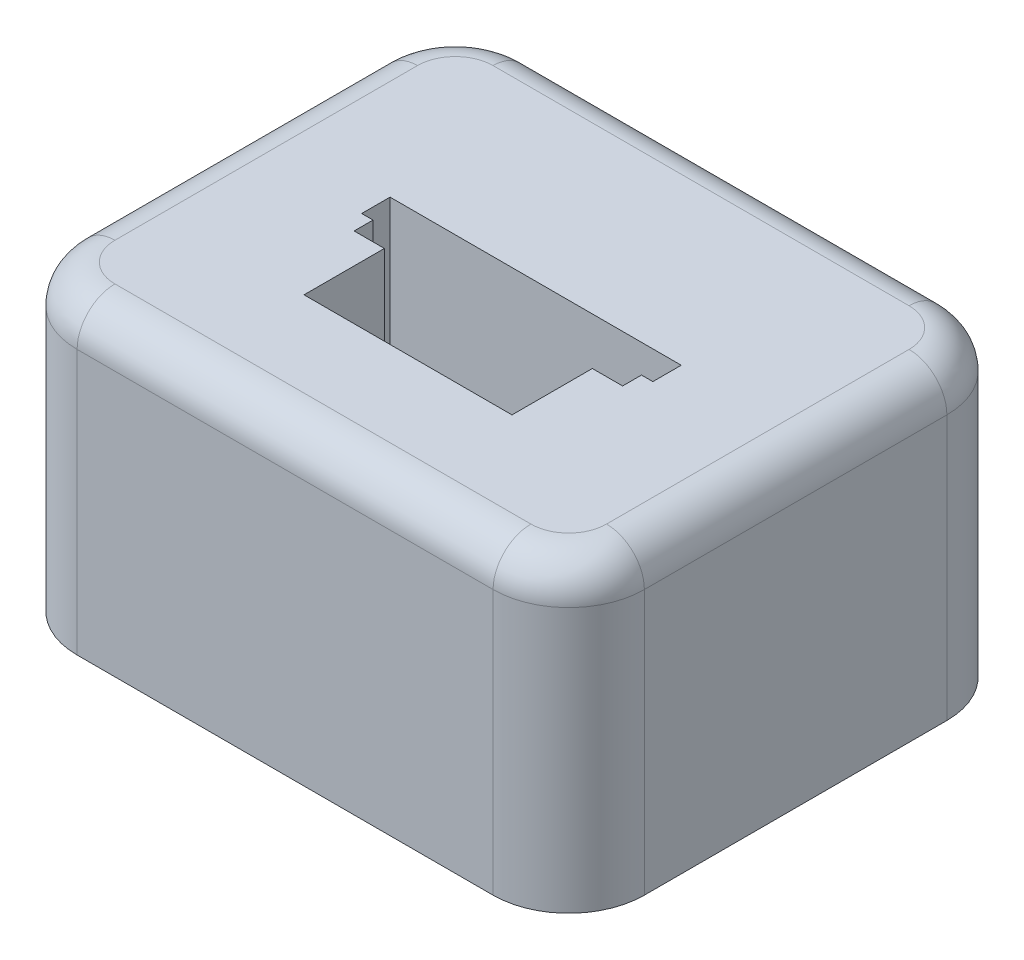
ISO-10303-21;
HEADER;
FILE_DESCRIPTION(('STEP AP214'),'2;1');
FILE_NAME('part.step','',(''),(''),'','','');
FILE_SCHEMA(('AUTOMOTIVE_DESIGN { 1 0 10303 214 1 1 1 1 }'));
ENDSEC;
DATA;
#1=APPLICATION_CONTEXT('core data for automotive mechanical design processes');
#2=APPLICATION_PROTOCOL_DEFINITION('international standard','automotive_design',2000,#1);
#3=PRODUCT_CONTEXT('',#1,'mechanical');
#4=PRODUCT('Part','Part','',(#3));
#5=PRODUCT_RELATED_PRODUCT_CATEGORY('part','',(#4));
#6=PRODUCT_DEFINITION_FORMATION('','',#4);
#7=PRODUCT_DEFINITION_CONTEXT('part definition',#1,'design');
#8=PRODUCT_DEFINITION('design','',#6,#7);
#9=PRODUCT_DEFINITION_SHAPE('','',#8);
#10=(LENGTH_UNIT() NAMED_UNIT(*) SI_UNIT(.MILLI.,.METRE.));
#11=(NAMED_UNIT(*) PLANE_ANGLE_UNIT() SI_UNIT($,.RADIAN.));
#12=(NAMED_UNIT(*) SI_UNIT($,.STERADIAN.) SOLID_ANGLE_UNIT());
#13=UNCERTAINTY_MEASURE_WITH_UNIT(LENGTH_MEASURE(1.E-05),#10,'distance_accuracy_value','');
#14=(GEOMETRIC_REPRESENTATION_CONTEXT(3) GLOBAL_UNCERTAINTY_ASSIGNED_CONTEXT((#13)) GLOBAL_UNIT_ASSIGNED_CONTEXT((#10,
#11,#12)) REPRESENTATION_CONTEXT('',''));
#15=CARTESIAN_POINT('',(0.,0.,0.));
#16=DIRECTION('',(0.,0.,1.));
#17=DIRECTION('',(1.,0.,0.));
#18=AXIS2_PLACEMENT_3D('',#15,#16,#17);
#19=CARTESIAN_POINT('',(26.,16.,-20.));
#20=DIRECTION('',(0.,-1.,0.));
#21=DIRECTION('',(0.,0.,-1.));
#22=AXIS2_PLACEMENT_3D('',#19,#20,#21);
#23=CYLINDRICAL_SURFACE('',#22,4.);
#24=DIRECTION('',(0.,-1.,0.));
#25=VECTOR('',#24,1.);
#26=CARTESIAN_POINT('',(26.,16.,-24.));
#27=LINE('',#26,#25);
#28=CARTESIAN_POINT('',(26.,14.,-24.));
#29=VERTEX_POINT('',#28);
#30=CARTESIAN_POINT('',(26.,0.,-24.));
#31=VERTEX_POINT('',#30);
#32=EDGE_CURVE('E470',#29,#31,#27,.T.);
#33=ORIENTED_EDGE('',*,*,#32,.F.);
#34=CARTESIAN_POINT('',(26.,14.,-20.));
#35=DIRECTION('',(0.,-1.,0.));
#36=DIRECTION('',(0.,0.,-1.));
#37=AXIS2_PLACEMENT_3D('',#34,#35,#36);
#38=CIRCLE('',#37,4.);
#39=CARTESIAN_POINT('',(30.,14.,-20.));
#40=VERTEX_POINT('',#39);
#41=EDGE_CURVE('E517',#29,#40,#38,.T.);
#42=ORIENTED_EDGE('',*,*,#41,.T.);
#43=DIRECTION('',(0.,-1.,0.));
#44=VECTOR('',#43,1.);
#45=CARTESIAN_POINT('',(30.,16.,-20.));
#46=LINE('',#45,#44);
#47=CARTESIAN_POINT('',(30.,0.,-20.));
#48=VERTEX_POINT('',#47);
#49=EDGE_CURVE('E449',#40,#48,#46,.T.);
#50=ORIENTED_EDGE('',*,*,#49,.T.);
#51=CARTESIAN_POINT('',(26.,0.,-20.));
#52=DIRECTION('',(0.,1.,0.));
#53=DIRECTION('',(0.,0.,-1.));
#54=AXIS2_PLACEMENT_3D('',#51,#52,#53);
#55=CIRCLE('',#54,4.);
#56=EDGE_CURVE('E416',#48,#31,#55,.T.);
#57=ORIENTED_EDGE('',*,*,#56,.T.);
#58=EDGE_LOOP('',(#33,#42,#50,#57));
#59=FACE_BOUND('',#58,.T.);
#60=ADVANCED_FACE('F45',(#59),#23,.T.);
#61=CARTESIAN_POINT('',(4.00000000000003,16.,-24.));
#62=DIRECTION('',(0.,0.,1.));
#63=DIRECTION('',(1.,0.,0.));
#64=AXIS2_PLACEMENT_3D('',#61,#62,#63);
#65=PLANE('',#64);
#66=DIRECTION('',(0.,-1.,0.));
#67=VECTOR('',#66,1.);
#68=CARTESIAN_POINT('',(4.00000000000003,16.,-24.));
#69=LINE('',#68,#67);
#70=CARTESIAN_POINT('',(4.00000000000003,14.,-24.));
#71=VERTEX_POINT('',#70);
#72=CARTESIAN_POINT('',(4.00000000000003,0.,-24.));
#73=VERTEX_POINT('',#72);
#74=EDGE_CURVE('E467',#71,#73,#69,.T.);
#75=ORIENTED_EDGE('',*,*,#74,.F.);
#76=DIRECTION('',(-1.,0.,0.));
#77=VECTOR('',#76,1.);
#78=CARTESIAN_POINT('',(4.00000000000003,14.,-24.));
#79=LINE('',#78,#77);
#80=EDGE_CURVE('E514',#71,#29,#79,.F.);
#81=ORIENTED_EDGE('',*,*,#80,.T.);
#82=ORIENTED_EDGE('',*,*,#32,.T.);
#83=DIRECTION('',(-1.,0.,0.));
#84=VECTOR('',#83,1.);
#85=CARTESIAN_POINT('',(4.00000000000003,0.,-24.));
#86=LINE('',#85,#84);
#87=EDGE_CURVE('E420',#31,#73,#86,.T.);
#88=ORIENTED_EDGE('',*,*,#87,.T.);
#89=EDGE_LOOP('',(#75,#81,#82,#88));
#90=FACE_BOUND('',#89,.T.);
#91=ADVANCED_FACE('F633',(#90),#65,.F.);
#92=CARTESIAN_POINT('',(4.,16.,-20.));
#93=DIRECTION('',(0.,-1.,0.));
#94=DIRECTION('',(0.,0.,-1.));
#95=AXIS2_PLACEMENT_3D('',#92,#93,#94);
#96=CYLINDRICAL_SURFACE('',#95,4.);
#97=DIRECTION('',(0.,-1.,0.));
#98=VECTOR('',#97,1.);
#99=CARTESIAN_POINT('',(0.,16.,-20.));
#100=LINE('',#99,#98);
#101=CARTESIAN_POINT('',(0.,14.,-20.));
#102=VERTEX_POINT('',#101);
#103=CARTESIAN_POINT('',(0.,0.,-20.));
#104=VERTEX_POINT('',#103);
#105=EDGE_CURVE('E464',#102,#104,#100,.T.);
#106=ORIENTED_EDGE('',*,*,#105,.F.);
#107=CARTESIAN_POINT('',(4.,14.,-20.));
#108=DIRECTION('',(0.,-1.,0.));
#109=DIRECTION('',(0.,0.,-1.));
#110=AXIS2_PLACEMENT_3D('',#107,#108,#109);
#111=CIRCLE('',#110,4.);
#112=EDGE_CURVE('E511',#102,#71,#111,.T.);
#113=ORIENTED_EDGE('',*,*,#112,.T.);
#114=ORIENTED_EDGE('',*,*,#74,.T.);
#115=CARTESIAN_POINT('',(4.,0.,-20.));
#116=DIRECTION('',(0.,1.,0.));
#117=DIRECTION('',(0.,0.,-1.));
#118=AXIS2_PLACEMENT_3D('',#115,#116,#117);
#119=CIRCLE('',#118,4.);
#120=EDGE_CURVE('E425',#73,#104,#119,.T.);
#121=ORIENTED_EDGE('',*,*,#120,.T.);
#122=EDGE_LOOP('',(#106,#113,#114,#121));
#123=FACE_BOUND('',#122,.T.);
#124=ADVANCED_FACE('F639',(#123),#96,.T.);
#125=CARTESIAN_POINT('',(0.,16.,-4.00000000000003));
#126=DIRECTION('',(1.,0.,0.));
#127=DIRECTION('',(0.,0.,-1.));
#128=AXIS2_PLACEMENT_3D('',#125,#126,#127);
#129=PLANE('',#128);
#130=DIRECTION('',(0.,-1.,0.));
#131=VECTOR('',#130,1.);
#132=CARTESIAN_POINT('',(0.,16.,-4.00000000000003));
#133=LINE('',#132,#131);
#134=CARTESIAN_POINT('',(0.,14.,-4.00000000000003));
#135=VERTEX_POINT('',#134);
#136=CARTESIAN_POINT('',(0.,0.,-4.00000000000003));
#137=VERTEX_POINT('',#136);
#138=EDGE_CURVE('E461',#135,#137,#133,.T.);
#139=ORIENTED_EDGE('',*,*,#138,.F.);
#140=DIRECTION('',(0.,0.,1.));
#141=VECTOR('',#140,1.);
#142=CARTESIAN_POINT('',(0.,14.,-4.00000000000003));
#143=LINE('',#142,#141);
#144=EDGE_CURVE('E508',#135,#102,#143,.F.);
#145=ORIENTED_EDGE('',*,*,#144,.T.);
#146=ORIENTED_EDGE('',*,*,#105,.T.);
#147=DIRECTION('',(0.,0.,1.));
#148=VECTOR('',#147,1.);
#149=CARTESIAN_POINT('',(0.,0.,-4.00000000000003));
#150=LINE('',#149,#148);
#151=EDGE_CURVE('E429',#104,#137,#150,.T.);
#152=ORIENTED_EDGE('',*,*,#151,.T.);
#153=EDGE_LOOP('',(#139,#145,#146,#152));
#154=FACE_BOUND('',#153,.T.);
#155=ADVANCED_FACE('F696',(#154),#129,.F.);
#156=CARTESIAN_POINT('',(4.,16.,-4.));
#157=DIRECTION('',(0.,-1.,0.));
#158=DIRECTION('',(0.,0.,-1.));
#159=AXIS2_PLACEMENT_3D('',#156,#157,#158);
#160=CYLINDRICAL_SURFACE('',#159,4.);
#161=DIRECTION('',(0.,-1.,0.));
#162=VECTOR('',#161,1.);
#163=CARTESIAN_POINT('',(4.00000000000003,16.,0.));
#164=LINE('',#163,#162);
#165=CARTESIAN_POINT('',(4.00000000000003,14.,0.));
#166=VERTEX_POINT('',#165);
#167=CARTESIAN_POINT('',(4.00000000000003,0.,0.));
#168=VERTEX_POINT('',#167);
#169=EDGE_CURVE('E458',#166,#168,#164,.T.);
#170=ORIENTED_EDGE('',*,*,#169,.F.);
#171=CARTESIAN_POINT('',(4.,14.,-4.));
#172=DIRECTION('',(0.,-1.,0.));
#173=DIRECTION('',(0.,0.,-1.));
#174=AXIS2_PLACEMENT_3D('',#171,#172,#173);
#175=CIRCLE('',#174,4.);
#176=EDGE_CURVE('E505',#166,#135,#175,.T.);
#177=ORIENTED_EDGE('',*,*,#176,.T.);
#178=ORIENTED_EDGE('',*,*,#138,.T.);
#179=CARTESIAN_POINT('',(4.,0.,-4.));
#180=DIRECTION('',(0.,1.,0.));
#181=DIRECTION('',(0.,0.,-1.));
#182=AXIS2_PLACEMENT_3D('',#179,#180,#181);
#183=CIRCLE('',#182,4.);
#184=EDGE_CURVE('E433',#137,#168,#183,.T.);
#185=ORIENTED_EDGE('',*,*,#184,.T.);
#186=EDGE_LOOP('',(#170,#177,#178,#185));
#187=FACE_BOUND('',#186,.T.);
#188=ADVANCED_FACE('F699',(#187),#160,.T.);
#189=CARTESIAN_POINT('',(4.00000000000003,16.,0.));
#190=DIRECTION('',(0.,0.,-1.));
#191=DIRECTION('',(-1.,0.,0.));
#192=AXIS2_PLACEMENT_3D('',#189,#190,#191);
#193=PLANE('',#192);
#194=DIRECTION('',(0.,-1.,0.));
#195=VECTOR('',#194,1.);
#196=CARTESIAN_POINT('',(26.,16.,0.));
#197=LINE('',#196,#195);
#198=CARTESIAN_POINT('',(26.,14.,0.));
#199=VERTEX_POINT('',#198);
#200=CARTESIAN_POINT('',(26.,0.,0.));
#201=VERTEX_POINT('',#200);
#202=EDGE_CURVE('E455',#199,#201,#197,.T.);
#203=ORIENTED_EDGE('',*,*,#202,.F.);
#204=DIRECTION('',(1.,0.,0.));
#205=VECTOR('',#204,1.);
#206=CARTESIAN_POINT('',(4.00000000000003,14.,0.));
#207=LINE('',#206,#205);
#208=EDGE_CURVE('E502',#199,#166,#207,.F.);
#209=ORIENTED_EDGE('',*,*,#208,.T.);
#210=ORIENTED_EDGE('',*,*,#169,.T.);
#211=DIRECTION('',(1.,0.,0.));
#212=VECTOR('',#211,1.);
#213=CARTESIAN_POINT('',(4.00000000000003,0.,0.));
#214=LINE('',#213,#212);
#215=EDGE_CURVE('E437',#168,#201,#214,.T.);
#216=ORIENTED_EDGE('',*,*,#215,.T.);
#217=EDGE_LOOP('',(#203,#209,#210,#216));
#218=FACE_BOUND('',#217,.T.);
#219=ADVANCED_FACE('F724',(#218),#193,.F.);
#220=CARTESIAN_POINT('',(26.,16.,-4.));
#221=DIRECTION('',(0.,-1.,0.));
#222=DIRECTION('',(0.,0.,-1.));
#223=AXIS2_PLACEMENT_3D('',#220,#221,#222);
#224=CYLINDRICAL_SURFACE('',#223,4.);
#225=DIRECTION('',(0.,-1.,0.));
#226=VECTOR('',#225,1.);
#227=CARTESIAN_POINT('',(30.,16.,-4.00000000000003));
#228=LINE('',#227,#226);
#229=CARTESIAN_POINT('',(30.,14.,-4.00000000000003));
#230=VERTEX_POINT('',#229);
#231=CARTESIAN_POINT('',(30.,0.,-4.00000000000003));
#232=VERTEX_POINT('',#231);
#233=EDGE_CURVE('E452',#230,#232,#228,.T.);
#234=ORIENTED_EDGE('',*,*,#233,.F.);
#235=CARTESIAN_POINT('',(26.,14.,-4.));
#236=DIRECTION('',(0.,-1.,0.));
#237=DIRECTION('',(0.,0.,-1.));
#238=AXIS2_PLACEMENT_3D('',#235,#236,#237);
#239=CIRCLE('',#238,4.);
#240=EDGE_CURVE('E498',#230,#199,#239,.T.);
#241=ORIENTED_EDGE('',*,*,#240,.T.);
#242=ORIENTED_EDGE('',*,*,#202,.T.);
#243=CARTESIAN_POINT('',(26.,0.,-4.));
#244=DIRECTION('',(0.,1.,0.));
#245=DIRECTION('',(0.,0.,1.));
#246=AXIS2_PLACEMENT_3D('',#243,#244,#245);
#247=CIRCLE('',#246,4.);
#248=EDGE_CURVE('E441',#201,#232,#247,.T.);
#249=ORIENTED_EDGE('',*,*,#248,.T.);
#250=EDGE_LOOP('',(#234,#241,#242,#249));
#251=FACE_BOUND('',#250,.T.);
#252=ADVANCED_FACE('F720',(#251),#224,.T.);
#253=CARTESIAN_POINT('',(30.,16.,-4.00000000000003));
#254=DIRECTION('',(-1.,0.,0.));
#255=DIRECTION('',(0.,0.,1.));
#256=AXIS2_PLACEMENT_3D('',#253,#254,#255);
#257=PLANE('',#256);
#258=ORIENTED_EDGE('',*,*,#49,.F.);
#259=DIRECTION('',(0.,0.,-1.));
#260=VECTOR('',#259,1.);
#261=CARTESIAN_POINT('',(30.,14.,-4.00000000000003));
#262=LINE('',#261,#260);
#263=EDGE_CURVE('E520',#40,#230,#262,.F.);
#264=ORIENTED_EDGE('',*,*,#263,.T.);
#265=ORIENTED_EDGE('',*,*,#233,.T.);
#266=DIRECTION('',(0.,0.,-1.));
#267=VECTOR('',#266,1.);
#268=CARTESIAN_POINT('',(30.,0.,-4.00000000000003));
#269=LINE('',#268,#267);
#270=EDGE_CURVE('E445',#232,#48,#269,.T.);
#271=ORIENTED_EDGE('',*,*,#270,.T.);
#272=EDGE_LOOP('',(#258,#264,#265,#271));
#273=FACE_BOUND('',#272,.T.);
#274=ADVANCED_FACE('F715',(#273),#257,.F.);
#275=CARTESIAN_POINT('',(26.,16.,-20.));
#276=DIRECTION('',(0.,-1.,0.));
#277=DIRECTION('',(0.,0.,-1.));
#278=AXIS2_PLACEMENT_3D('',#275,#276,#277);
#279=PLANE('',#278);
#280=DIRECTION('',(0.,0.,-1.));
#281=VECTOR('',#280,1.);
#282=CARTESIAN_POINT('',(22.1,16.,-11.75));
#283=LINE('',#282,#281);
#284=CARTESIAN_POINT('',(22.1,16.,-10.75));
#285=VERTEX_POINT('',#284);
#286=CARTESIAN_POINT('',(22.1,16.,-11.75));
#287=VERTEX_POINT('',#286);
#288=EDGE_CURVE('E69',#285,#287,#283,.T.);
#289=ORIENTED_EDGE('',*,*,#288,.F.);
#290=DIRECTION('',(1.,0.,0.));
#291=VECTOR('',#290,1.);
#292=CARTESIAN_POINT('',(7.9,16.,-10.75));
#293=LINE('',#292,#291);
#294=CARTESIAN_POINT('',(20.5,16.,-10.75));
#295=VERTEX_POINT('',#294);
#296=EDGE_CURVE('E252',#295,#285,#293,.T.);
#297=ORIENTED_EDGE('',*,*,#296,.F.);
#298=DIRECTION('',(0.,0.,-1.));
#299=VECTOR('',#298,1.);
#300=CARTESIAN_POINT('',(20.5,16.,-9.5));
#301=LINE('',#300,#299);
#302=CARTESIAN_POINT('',(20.5,16.,-6.5));
#303=VERTEX_POINT('',#302);
#304=EDGE_CURVE('E360',#303,#295,#301,.T.);
#305=ORIENTED_EDGE('',*,*,#304,.F.);
#306=DIRECTION('',(1.,0.,0.));
#307=VECTOR('',#306,1.);
#308=CARTESIAN_POINT('',(9.5,16.,-6.5));
#309=LINE('',#308,#307);
#310=CARTESIAN_POINT('',(9.5,16.,-6.5));
#311=VERTEX_POINT('',#310);
#312=EDGE_CURVE('E356',#311,#303,#309,.T.);
#313=ORIENTED_EDGE('',*,*,#312,.F.);
#314=DIRECTION('',(0.,0.,1.));
#315=VECTOR('',#314,1.);
#316=CARTESIAN_POINT('',(9.5,16.,-9.5));
#317=LINE('',#316,#315);
#318=CARTESIAN_POINT('',(9.5,16.,-10.75));
#319=VERTEX_POINT('',#318);
#320=EDGE_CURVE('E353',#319,#311,#317,.T.);
#321=ORIENTED_EDGE('',*,*,#320,.F.);
#322=CARTESIAN_POINT('',(7.9,16.,-10.75));
#323=VERTEX_POINT('',#322);
#324=EDGE_CURVE('E585',#323,#319,#293,.T.);
#325=ORIENTED_EDGE('',*,*,#324,.F.);
#326=DIRECTION('',(0.,0.,1.));
#327=VECTOR('',#326,1.);
#328=CARTESIAN_POINT('',(7.9,16.,-11.75));
#329=LINE('',#328,#327);
#330=CARTESIAN_POINT('',(7.9,16.,-11.75));
#331=VERTEX_POINT('',#330);
#332=EDGE_CURVE('E596',#331,#323,#329,.T.);
#333=ORIENTED_EDGE('',*,*,#332,.F.);
#334=DIRECTION('',(1.,0.,0.));
#335=VECTOR('',#334,1.);
#336=CARTESIAN_POINT('',(7.3,16.,-11.75));
#337=LINE('',#336,#335);
#338=CARTESIAN_POINT('',(7.3,16.,-11.75));
#339=VERTEX_POINT('',#338);
#340=EDGE_CURVE('E304',#339,#331,#337,.T.);
#341=ORIENTED_EDGE('',*,*,#340,.F.);
#342=DIRECTION('',(0.,0.,1.));
#343=VECTOR('',#342,1.);
#344=CARTESIAN_POINT('',(7.3,16.,-13.25));
#345=LINE('',#344,#343);
#346=CARTESIAN_POINT('',(7.3,16.,-13.25));
#347=VERTEX_POINT('',#346);
#348=EDGE_CURVE('E281',#347,#339,#345,.T.);
#349=ORIENTED_EDGE('',*,*,#348,.F.);
#350=DIRECTION('',(-1.,0.,0.));
#351=VECTOR('',#350,1.);
#352=CARTESIAN_POINT('',(7.3,16.,-13.25));
#353=LINE('',#352,#351);
#354=CARTESIAN_POINT('',(22.7,16.,-13.25));
#355=VERTEX_POINT('',#354);
#356=EDGE_CURVE('E296',#355,#347,#353,.T.);
#357=ORIENTED_EDGE('',*,*,#356,.F.);
#358=DIRECTION('',(0.,0.,-1.));
#359=VECTOR('',#358,1.);
#360=CARTESIAN_POINT('',(22.7,16.,-13.25));
#361=LINE('',#360,#359);
#362=CARTESIAN_POINT('',(22.7,16.,-11.75));
#363=VERTEX_POINT('',#362);
#364=EDGE_CURVE('E300',#363,#355,#361,.T.);
#365=ORIENTED_EDGE('',*,*,#364,.F.);
#366=EDGE_CURVE('E308',#287,#363,#337,.T.);
#367=ORIENTED_EDGE('',*,*,#366,.F.);
#368=EDGE_LOOP('',(#289,#297,#305,#313,#321,#325,#333,#341,#349,#357,#365,#367));
#369=FACE_BOUND('',#368,.T.);
#370=DIRECTION('',(1.,0.,0.));
#371=VECTOR('',#370,1.);
#372=CARTESIAN_POINT('',(26.,16.,-2.));
#373=LINE('',#372,#371);
#374=CARTESIAN_POINT('',(4.00000000000003,16.,-2.));
#375=VERTEX_POINT('',#374);
#376=CARTESIAN_POINT('',(26.,16.,-2.));
#377=VERTEX_POINT('',#376);
#378=EDGE_CURVE('E491',#375,#377,#373,.T.);
#379=ORIENTED_EDGE('',*,*,#378,.T.);
#380=CARTESIAN_POINT('',(26.,16.,-4.));
#381=DIRECTION('',(0.,-1.,0.));
#382=DIRECTION('',(0.,0.,-1.));
#383=AXIS2_PLACEMENT_3D('',#380,#381,#382);
#384=CIRCLE('',#383,2.);
#385=CARTESIAN_POINT('',(28.,16.,-4.00000000000001));
#386=VERTEX_POINT('',#385);
#387=EDGE_CURVE('E494',#377,#386,#384,.F.);
#388=ORIENTED_EDGE('',*,*,#387,.T.);
#389=DIRECTION('',(0.,0.,-1.));
#390=VECTOR('',#389,1.);
#391=CARTESIAN_POINT('',(28.,16.,-20.));
#392=LINE('',#391,#390);
#393=CARTESIAN_POINT('',(28.,16.,-20.));
#394=VERTEX_POINT('',#393);
#395=EDGE_CURVE('E473',#386,#394,#392,.T.);
#396=ORIENTED_EDGE('',*,*,#395,.T.);
#397=CARTESIAN_POINT('',(26.,16.,-20.));
#398=DIRECTION('',(0.,-1.,0.));
#399=DIRECTION('',(0.,0.,-1.));
#400=AXIS2_PLACEMENT_3D('',#397,#398,#399);
#401=CIRCLE('',#400,2.);
#402=CARTESIAN_POINT('',(26.,16.,-22.));
#403=VERTEX_POINT('',#402);
#404=EDGE_CURVE('E476',#394,#403,#401,.F.);
#405=ORIENTED_EDGE('',*,*,#404,.T.);
#406=DIRECTION('',(-1.,0.,0.));
#407=VECTOR('',#406,1.);
#408=CARTESIAN_POINT('',(26.,16.,-22.));
#409=LINE('',#408,#407);
#410=CARTESIAN_POINT('',(4.00000000000001,16.,-22.));
#411=VERTEX_POINT('',#410);
#412=EDGE_CURVE('E479',#403,#411,#409,.T.);
#413=ORIENTED_EDGE('',*,*,#412,.T.);
#414=CARTESIAN_POINT('',(4.,16.,-20.));
#415=DIRECTION('',(0.,-1.,0.));
#416=DIRECTION('',(0.,0.,-1.));
#417=AXIS2_PLACEMENT_3D('',#414,#415,#416);
#418=CIRCLE('',#417,2.);
#419=CARTESIAN_POINT('',(2.,16.,-20.));
#420=VERTEX_POINT('',#419);
#421=EDGE_CURVE('E482',#411,#420,#418,.F.);
#422=ORIENTED_EDGE('',*,*,#421,.T.);
#423=DIRECTION('',(0.,0.,1.));
#424=VECTOR('',#423,1.);
#425=CARTESIAN_POINT('',(2.,16.,-20.));
#426=LINE('',#425,#424);
#427=CARTESIAN_POINT('',(2.,16.,-4.00000000000001));
#428=VERTEX_POINT('',#427);
#429=EDGE_CURVE('E485',#420,#428,#426,.T.);
#430=ORIENTED_EDGE('',*,*,#429,.T.);
#431=CARTESIAN_POINT('',(4.,16.,-4.));
#432=DIRECTION('',(0.,-1.,0.));
#433=DIRECTION('',(0.,0.,-1.));
#434=AXIS2_PLACEMENT_3D('',#431,#432,#433);
#435=CIRCLE('',#434,2.);
#436=EDGE_CURVE('E488',#428,#375,#435,.F.);
#437=ORIENTED_EDGE('',*,*,#436,.T.);
#438=EDGE_LOOP('',(#379,#388,#396,#405,#413,#422,#430,#437));
#439=FACE_BOUND('',#438,.T.);
#440=ADVANCED_FACE('F582',(#369,#439),#279,.F.);
#441=CARTESIAN_POINT('',(26.,0.,-20.));
#442=DIRECTION('',(0.,-1.,0.));
#443=DIRECTION('',(0.,0.,-1.));
#444=AXIS2_PLACEMENT_3D('',#441,#442,#443);
#445=PLANE('',#444);
#446=DIRECTION('',(0.,0.,1.));
#447=VECTOR('',#446,1.);
#448=CARTESIAN_POINT('',(9.5,0.,-9.5));
#449=LINE('',#448,#447);
#450=CARTESIAN_POINT('',(9.5,0.,-9.5));
#451=VERTEX_POINT('',#450);
#452=CARTESIAN_POINT('',(9.5,0.,-6.5));
#453=VERTEX_POINT('',#452);
#454=EDGE_CURVE('E349',#451,#453,#449,.T.);
#455=ORIENTED_EDGE('',*,*,#454,.T.);
#456=DIRECTION('',(1.,0.,0.));
#457=VECTOR('',#456,1.);
#458=CARTESIAN_POINT('',(9.5,0.,-6.5));
#459=LINE('',#458,#457);
#460=CARTESIAN_POINT('',(20.5,0.,-6.5));
#461=VERTEX_POINT('',#460);
#462=EDGE_CURVE('E369',#453,#461,#459,.T.);
#463=ORIENTED_EDGE('',*,*,#462,.T.);
#464=DIRECTION('',(0.,0.,-1.));
#465=VECTOR('',#464,1.);
#466=CARTESIAN_POINT('',(20.5,0.,-9.5));
#467=LINE('',#466,#465);
#468=CARTESIAN_POINT('',(20.5,0.,-9.5));
#469=VERTEX_POINT('',#468);
#470=EDGE_CURVE('E341',#461,#469,#467,.T.);
#471=ORIENTED_EDGE('',*,*,#470,.T.);
#472=DIRECTION('',(-1.,0.,0.));
#473=VECTOR('',#472,1.);
#474=CARTESIAN_POINT('',(9.5,0.,-9.5));
#475=LINE('',#474,#473);
#476=EDGE_CURVE('E345',#469,#451,#475,.T.);
#477=ORIENTED_EDGE('',*,*,#476,.T.);
#478=EDGE_LOOP('',(#455,#463,#471,#477));
#479=FACE_BOUND('',#478,.T.);
#480=CARTESIAN_POINT('',(4.,0.,-20.));
#481=DIRECTION('',(0.,-1.,0.));
#482=DIRECTION('',(0.,0.,-1.));
#483=AXIS2_PLACEMENT_3D('',#480,#481,#482);
#484=CIRCLE('',#483,0.9);
#485=CARTESIAN_POINT('',(4.,0.,-20.9));
#486=VERTEX_POINT('',#485);
#487=EDGE_CURVE('E383',#486,#486,#484,.T.);
#488=ORIENTED_EDGE('',*,*,#487,.F.);
#489=EDGE_LOOP('',(#488));
#490=FACE_BOUND('',#489,.T.);
#491=CARTESIAN_POINT('',(26.,0.,-20.));
#492=DIRECTION('',(0.,-1.,0.));
#493=DIRECTION('',(0.,0.,-1.));
#494=AXIS2_PLACEMENT_3D('',#491,#492,#493);
#495=CIRCLE('',#494,0.900000000000001);
#496=CARTESIAN_POINT('',(26.,0.,-20.9));
#497=VERTEX_POINT('',#496);
#498=EDGE_CURVE('E397',#497,#497,#495,.T.);
#499=ORIENTED_EDGE('',*,*,#498,.F.);
#500=EDGE_LOOP('',(#499));
#501=FACE_BOUND('',#500,.T.);
#502=CARTESIAN_POINT('',(26.,0.,-4.));
#503=DIRECTION('',(0.,-1.,0.));
#504=DIRECTION('',(0.,0.,-1.));
#505=AXIS2_PLACEMENT_3D('',#502,#503,#504);
#506=CIRCLE('',#505,0.9);
#507=CARTESIAN_POINT('',(26.,0.,-4.9));
#508=VERTEX_POINT('',#507);
#509=EDGE_CURVE('E389',#508,#508,#506,.T.);
#510=ORIENTED_EDGE('',*,*,#509,.F.);
#511=EDGE_LOOP('',(#510));
#512=FACE_BOUND('',#511,.T.);
#513=CARTESIAN_POINT('',(4.,0.,-4.));
#514=DIRECTION('',(0.,-1.,0.));
#515=DIRECTION('',(0.,0.,-1.));
#516=AXIS2_PLACEMENT_3D('',#513,#514,#515);
#517=CIRCLE('',#516,0.9);
#518=CARTESIAN_POINT('',(4.,0.,-4.9));
#519=VERTEX_POINT('',#518);
#520=EDGE_CURVE('E388',#519,#519,#517,.T.);
#521=ORIENTED_EDGE('',*,*,#520,.F.);
#522=EDGE_LOOP('',(#521));
#523=FACE_BOUND('',#522,.T.);
#524=ORIENTED_EDGE('',*,*,#56,.F.);
#525=ORIENTED_EDGE('',*,*,#270,.F.);
#526=ORIENTED_EDGE('',*,*,#248,.F.);
#527=ORIENTED_EDGE('',*,*,#215,.F.);
#528=ORIENTED_EDGE('',*,*,#184,.F.);
#529=ORIENTED_EDGE('',*,*,#151,.F.);
#530=ORIENTED_EDGE('',*,*,#120,.F.);
#531=ORIENTED_EDGE('',*,*,#87,.F.);
#532=EDGE_LOOP('',(#524,#525,#526,#527,#528,#529,#530,#531));
#533=FACE_BOUND('',#532,.T.);
#534=ADVANCED_FACE('F573',(#479,#490,#501,#512,#523,#533),#445,.T.);
#535=CARTESIAN_POINT('',(4.,14.,-20.));
#536=DIRECTION('',(0.,-1.,0.));
#537=DIRECTION('',(0.,0.,-1.));
#538=AXIS2_PLACEMENT_3D('',#535,#536,#537);
#539=DEGENERATE_TOROIDAL_SURFACE('',#538,2.,2.,.T.);
#540=CARTESIAN_POINT('',(4.00000000000001,14.,-22.));
#541=DIRECTION('',(1.,0.,0.));
#542=DIRECTION('',(0.,0.,-1.));
#543=AXIS2_PLACEMENT_3D('',#540,#541,#542);
#544=CIRCLE('',#543,2.);
#545=EDGE_CURVE('E544',#71,#411,#544,.T.);
#546=ORIENTED_EDGE('',*,*,#545,.F.);
#547=ORIENTED_EDGE('',*,*,#112,.F.);
#548=CARTESIAN_POINT('',(2.,14.,-20.));
#549=DIRECTION('',(0.,0.,1.));
#550=DIRECTION('',(1.,0.,0.));
#551=AXIS2_PLACEMENT_3D('',#548,#549,#550);
#552=CIRCLE('',#551,2.);
#553=EDGE_CURVE('E421',#420,#102,#552,.T.);
#554=ORIENTED_EDGE('',*,*,#553,.F.);
#555=ORIENTED_EDGE('',*,*,#421,.F.);
#556=EDGE_LOOP('',(#546,#547,#554,#555));
#557=FACE_BOUND('',#556,.T.);
#558=ADVANCED_FACE('F47',(#557),#539,.T.);
#559=CARTESIAN_POINT('',(2.,14.,-20.));
#560=DIRECTION('',(0.,0.,1.));
#561=DIRECTION('',(1.,0.,0.));
#562=AXIS2_PLACEMENT_3D('',#559,#560,#561);
#563=CYLINDRICAL_SURFACE('',#562,2.);
#564=ORIENTED_EDGE('',*,*,#553,.T.);
#565=ORIENTED_EDGE('',*,*,#144,.F.);
#566=CARTESIAN_POINT('',(2.,14.,-4.00000000000001));
#567=DIRECTION('',(0.,0.,1.));
#568=DIRECTION('',(1.,0.,0.));
#569=AXIS2_PLACEMENT_3D('',#566,#567,#568);
#570=CIRCLE('',#569,2.);
#571=EDGE_CURVE('E540',#428,#135,#570,.T.);
#572=ORIENTED_EDGE('',*,*,#571,.F.);
#573=ORIENTED_EDGE('',*,*,#429,.F.);
#574=EDGE_LOOP('',(#564,#565,#572,#573));
#575=FACE_BOUND('',#574,.T.);
#576=ADVANCED_FACE('F668',(#575),#563,.T.);
#577=CARTESIAN_POINT('',(26.,14.,-22.));
#578=DIRECTION('',(-1.,0.,0.));
#579=DIRECTION('',(0.,0.,1.));
#580=AXIS2_PLACEMENT_3D('',#577,#578,#579);
#581=CYLINDRICAL_SURFACE('',#580,2.);
#582=ORIENTED_EDGE('',*,*,#545,.T.);
#583=ORIENTED_EDGE('',*,*,#412,.F.);
#584=CARTESIAN_POINT('',(26.,14.,-22.));
#585=DIRECTION('',(1.,0.,0.));
#586=DIRECTION('',(0.,0.,-1.));
#587=AXIS2_PLACEMENT_3D('',#584,#585,#586);
#588=CIRCLE('',#587,2.);
#589=EDGE_CURVE('E536',#29,#403,#588,.T.);
#590=ORIENTED_EDGE('',*,*,#589,.F.);
#591=ORIENTED_EDGE('',*,*,#80,.F.);
#592=EDGE_LOOP('',(#582,#583,#590,#591));
#593=FACE_BOUND('',#592,.T.);
#594=ADVANCED_FACE('F665',(#593),#581,.T.);
#595=CARTESIAN_POINT('',(4.,14.,-4.));
#596=DIRECTION('',(0.,-1.,0.));
#597=DIRECTION('',(0.,0.,-1.));
#598=AXIS2_PLACEMENT_3D('',#595,#596,#597);
#599=DEGENERATE_TOROIDAL_SURFACE('',#598,2.,2.,.T.);
#600=ORIENTED_EDGE('',*,*,#571,.T.);
#601=ORIENTED_EDGE('',*,*,#176,.F.);
#602=CARTESIAN_POINT('',(4.00000000000003,14.,-2.));
#603=DIRECTION('',(1.,0.,0.));
#604=DIRECTION('',(0.,0.,-1.));
#605=AXIS2_PLACEMENT_3D('',#602,#603,#604);
#606=CIRCLE('',#605,2.);
#607=EDGE_CURVE('E532',#375,#166,#606,.T.);
#608=ORIENTED_EDGE('',*,*,#607,.F.);
#609=ORIENTED_EDGE('',*,*,#436,.F.);
#610=EDGE_LOOP('',(#600,#601,#608,#609));
#611=FACE_BOUND('',#610,.T.);
#612=ADVANCED_FACE('F661',(#611),#599,.T.);
#613=CARTESIAN_POINT('',(26.,14.,-20.));
#614=DIRECTION('',(0.,-1.,0.));
#615=DIRECTION('',(0.,0.,-1.));
#616=AXIS2_PLACEMENT_3D('',#613,#614,#615);
#617=DEGENERATE_TOROIDAL_SURFACE('',#616,2.,2.,.T.);
#618=ORIENTED_EDGE('',*,*,#589,.T.);
#619=ORIENTED_EDGE('',*,*,#404,.F.);
#620=CARTESIAN_POINT('',(28.,14.,-20.));
#621=DIRECTION('',(0.,0.,1.));
#622=DIRECTION('',(1.,0.,0.));
#623=AXIS2_PLACEMENT_3D('',#620,#621,#622);
#624=CIRCLE('',#623,2.);
#625=EDGE_CURVE('E528',#40,#394,#624,.T.);
#626=ORIENTED_EDGE('',*,*,#625,.F.);
#627=ORIENTED_EDGE('',*,*,#41,.F.);
#628=EDGE_LOOP('',(#618,#619,#626,#627));
#629=FACE_BOUND('',#628,.T.);
#630=ADVANCED_FACE('F657',(#629),#617,.T.);
#631=CARTESIAN_POINT('',(26.,14.,-2.));
#632=DIRECTION('',(1.,0.,0.));
#633=DIRECTION('',(0.,0.,-1.));
#634=AXIS2_PLACEMENT_3D('',#631,#632,#633);
#635=CYLINDRICAL_SURFACE('',#634,2.);
#636=ORIENTED_EDGE('',*,*,#607,.T.);
#637=ORIENTED_EDGE('',*,*,#208,.F.);
#638=CARTESIAN_POINT('',(26.,14.,-2.));
#639=DIRECTION('',(1.,0.,0.));
#640=DIRECTION('',(0.,0.,-1.));
#641=AXIS2_PLACEMENT_3D('',#638,#639,#640);
#642=CIRCLE('',#641,2.);
#643=EDGE_CURVE('E525',#377,#199,#642,.T.);
#644=ORIENTED_EDGE('',*,*,#643,.F.);
#645=ORIENTED_EDGE('',*,*,#378,.F.);
#646=EDGE_LOOP('',(#636,#637,#644,#645));
#647=FACE_BOUND('',#646,.T.);
#648=ADVANCED_FACE('F653',(#647),#635,.T.);
#649=CARTESIAN_POINT('',(28.,14.,-20.));
#650=DIRECTION('',(0.,0.,-1.));
#651=DIRECTION('',(-1.,0.,0.));
#652=AXIS2_PLACEMENT_3D('',#649,#650,#651);
#653=CYLINDRICAL_SURFACE('',#652,2.);
#654=ORIENTED_EDGE('',*,*,#625,.T.);
#655=ORIENTED_EDGE('',*,*,#395,.F.);
#656=CARTESIAN_POINT('',(28.,14.,-4.00000000000003));
#657=DIRECTION('',(0.,0.,1.));
#658=DIRECTION('',(0.,-1.,0.));
#659=AXIS2_PLACEMENT_3D('',#656,#657,#658);
#660=CIRCLE('',#659,2.);
#661=EDGE_CURVE('E412',#230,#386,#660,.T.);
#662=ORIENTED_EDGE('',*,*,#661,.F.);
#663=ORIENTED_EDGE('',*,*,#263,.F.);
#664=EDGE_LOOP('',(#654,#655,#662,#663));
#665=FACE_BOUND('',#664,.T.);
#666=ADVANCED_FACE('F649',(#665),#653,.T.);
#667=CARTESIAN_POINT('',(26.,14.,-4.));
#668=DIRECTION('',(0.,-1.,0.));
#669=DIRECTION('',(0.,0.,-1.));
#670=AXIS2_PLACEMENT_3D('',#667,#668,#669);
#671=DEGENERATE_TOROIDAL_SURFACE('',#670,2.,2.,.T.);
#672=ORIENTED_EDGE('',*,*,#643,.T.);
#673=ORIENTED_EDGE('',*,*,#240,.F.);
#674=ORIENTED_EDGE('',*,*,#661,.T.);
#675=ORIENTED_EDGE('',*,*,#387,.F.);
#676=EDGE_LOOP('',(#672,#673,#674,#675));
#677=FACE_BOUND('',#676,.T.);
#678=ADVANCED_FACE('F645',(#677),#671,.T.);
#679=CARTESIAN_POINT('',(4.,7.,-4.));
#680=DIRECTION('',(0.,-1.,0.));
#681=DIRECTION('',(0.,0.,-1.));
#682=AXIS2_PLACEMENT_3D('',#679,#680,#681);
#683=CYLINDRICAL_SURFACE('',#682,0.9);
#684=CARTESIAN_POINT('',(4.,7.,-4.));
#685=DIRECTION('',(0.,-1.,0.));
#686=DIRECTION('',(0.,0.,-1.));
#687=AXIS2_PLACEMENT_3D('',#684,#685,#686);
#688=CIRCLE('',#687,0.9);
#689=CARTESIAN_POINT('',(4.,7.,-4.9));
#690=VERTEX_POINT('',#689);
#691=EDGE_CURVE('E408',#690,#690,#688,.T.);
#692=ORIENTED_EDGE('',*,*,#691,.F.);
#693=EDGE_LOOP('',(#692));
#694=FACE_BOUND('',#693,.T.);
#695=ORIENTED_EDGE('',*,*,#520,.T.);
#696=EDGE_LOOP('',(#695));
#697=FACE_BOUND('',#696,.T.);
#698=ADVANCED_FACE('F648',(#694,#697),#683,.F.);
#699=CARTESIAN_POINT('',(4.,7.,-4.));
#700=DIRECTION('',(0.,-1.,0.));
#701=DIRECTION('',(0.,0.,-1.));
#702=AXIS2_PLACEMENT_3D('',#699,#700,#701);
#703=PLANE('',#702);
#704=ORIENTED_EDGE('',*,*,#691,.T.);
#705=EDGE_LOOP('',(#704));
#706=FACE_BOUND('',#705,.T.);
#707=ADVANCED_FACE('F826',(#706),#703,.T.);
#708=CARTESIAN_POINT('',(26.,7.,-4.));
#709=DIRECTION('',(0.,-1.,0.));
#710=DIRECTION('',(0.,0.,-1.));
#711=AXIS2_PLACEMENT_3D('',#708,#709,#710);
#712=CYLINDRICAL_SURFACE('',#711,0.9);
#713=CARTESIAN_POINT('',(26.,7.,-4.));
#714=DIRECTION('',(0.,-1.,0.));
#715=DIRECTION('',(0.,0.,-1.));
#716=AXIS2_PLACEMENT_3D('',#713,#714,#715);
#717=CIRCLE('',#716,0.9);
#718=CARTESIAN_POINT('',(26.,7.,-4.9));
#719=VERTEX_POINT('',#718);
#720=EDGE_CURVE('E384',#719,#719,#717,.T.);
#721=ORIENTED_EDGE('',*,*,#720,.F.);
#722=EDGE_LOOP('',(#721));
#723=FACE_BOUND('',#722,.T.);
#724=ORIENTED_EDGE('',*,*,#509,.T.);
#725=EDGE_LOOP('',(#724));
#726=FACE_BOUND('',#725,.T.);
#727=ADVANCED_FACE('F836',(#723,#726),#712,.F.);
#728=CARTESIAN_POINT('',(26.,7.,-4.));
#729=DIRECTION('',(0.,-1.,0.));
#730=DIRECTION('',(0.,0.,-1.));
#731=AXIS2_PLACEMENT_3D('',#728,#729,#730);
#732=PLANE('',#731);
#733=ORIENTED_EDGE('',*,*,#720,.T.);
#734=EDGE_LOOP('',(#733));
#735=FACE_BOUND('',#734,.T.);
#736=ADVANCED_FACE('F846',(#735),#732,.T.);
#737=CARTESIAN_POINT('',(26.,7.,-20.));
#738=DIRECTION('',(0.,-1.,0.));
#739=DIRECTION('',(0.,0.,-1.));
#740=AXIS2_PLACEMENT_3D('',#737,#738,#739);
#741=CYLINDRICAL_SURFACE('',#740,0.900000000000001);
#742=CARTESIAN_POINT('',(26.,7.,-20.));
#743=DIRECTION('',(0.,-1.,0.));
#744=DIRECTION('',(0.,0.,-1.));
#745=AXIS2_PLACEMENT_3D('',#742,#743,#744);
#746=CIRCLE('',#745,0.900000000000001);
#747=CARTESIAN_POINT('',(26.,7.,-20.9));
#748=VERTEX_POINT('',#747);
#749=EDGE_CURVE('E393',#748,#748,#746,.T.);
#750=ORIENTED_EDGE('',*,*,#749,.F.);
#751=EDGE_LOOP('',(#750));
#752=FACE_BOUND('',#751,.T.);
#753=ORIENTED_EDGE('',*,*,#498,.T.);
#754=EDGE_LOOP('',(#753));
#755=FACE_BOUND('',#754,.T.);
#756=ADVANCED_FACE('F856',(#752,#755),#741,.F.);
#757=CARTESIAN_POINT('',(26.,7.,-20.));
#758=DIRECTION('',(0.,-1.,0.));
#759=DIRECTION('',(0.,0.,-1.));
#760=AXIS2_PLACEMENT_3D('',#757,#758,#759);
#761=PLANE('',#760);
#762=ORIENTED_EDGE('',*,*,#749,.T.);
#763=EDGE_LOOP('',(#762));
#764=FACE_BOUND('',#763,.T.);
#765=ADVANCED_FACE('F866',(#764),#761,.T.);
#766=CARTESIAN_POINT('',(4.,7.,-20.));
#767=DIRECTION('',(0.,-1.,0.));
#768=DIRECTION('',(0.,0.,-1.));
#769=AXIS2_PLACEMENT_3D('',#766,#767,#768);
#770=CYLINDRICAL_SURFACE('',#769,0.9);
#771=CARTESIAN_POINT('',(4.,7.,-20.));
#772=DIRECTION('',(0.,-1.,0.));
#773=DIRECTION('',(0.,0.,-1.));
#774=AXIS2_PLACEMENT_3D('',#771,#772,#773);
#775=CIRCLE('',#774,0.9);
#776=CARTESIAN_POINT('',(4.,7.,-20.9));
#777=VERTEX_POINT('',#776);
#778=EDGE_CURVE('E401',#777,#777,#775,.T.);
#779=ORIENTED_EDGE('',*,*,#778,.F.);
#780=EDGE_LOOP('',(#779));
#781=FACE_BOUND('',#780,.T.);
#782=ORIENTED_EDGE('',*,*,#487,.T.);
#783=EDGE_LOOP('',(#782));
#784=FACE_BOUND('',#783,.T.);
#785=ADVANCED_FACE('F876',(#781,#784),#770,.F.);
#786=CARTESIAN_POINT('',(4.,7.,-20.));
#787=DIRECTION('',(0.,-1.,0.));
#788=DIRECTION('',(0.,0.,-1.));
#789=AXIS2_PLACEMENT_3D('',#786,#787,#788);
#790=PLANE('',#789);
#791=ORIENTED_EDGE('',*,*,#778,.T.);
#792=EDGE_LOOP('',(#791));
#793=FACE_BOUND('',#792,.T.);
#794=ADVANCED_FACE('F886',(#793),#790,.T.);
#795=CARTESIAN_POINT('',(9.5,-0.001000000000001,-9.5));
#796=DIRECTION('',(-1.,0.,0.));
#797=DIRECTION('',(0.,0.,1.));
#798=AXIS2_PLACEMENT_3D('',#795,#796,#797);
#799=PLANE('',#798);
#800=DIRECTION('',(0.,1.,0.));
#801=VECTOR('',#800,1.);
#802=CARTESIAN_POINT('',(9.5,-3.22775578644281,-11.75));
#803=LINE('',#802,#801);
#804=CARTESIAN_POINT('',(9.5,8.5,-11.75));
#805=VERTEX_POINT('',#804);
#806=CARTESIAN_POINT('',(9.5,9.5,-11.75));
#807=VERTEX_POINT('',#806);
#808=EDGE_CURVE('E282',#805,#807,#803,.T.);
#809=ORIENTED_EDGE('',*,*,#808,.T.);
#810=DIRECTION('',(0.,0.,1.));
#811=VECTOR('',#810,1.);
#812=CARTESIAN_POINT('',(9.5,9.5,-9.5));
#813=LINE('',#812,#811);
#814=CARTESIAN_POINT('',(9.5,9.5,-10.75));
#815=VERTEX_POINT('',#814);
#816=EDGE_CURVE('E265',#807,#815,#813,.T.);
#817=ORIENTED_EDGE('',*,*,#816,.T.);
#818=DIRECTION('',(0.,1.,0.));
#819=VECTOR('',#818,1.);
#820=CARTESIAN_POINT('',(9.5,-0.001000000000001,-10.75));
#821=LINE('',#820,#819);
#822=EDGE_CURVE('E269',#815,#319,#821,.T.);
#823=ORIENTED_EDGE('',*,*,#822,.T.);
#824=ORIENTED_EDGE('',*,*,#320,.T.);
#825=DIRECTION('',(0.,1.,0.));
#826=VECTOR('',#825,1.);
#827=CARTESIAN_POINT('',(9.5,-0.001000000000001,-6.5));
#828=LINE('',#827,#826);
#829=EDGE_CURVE('E364',#453,#311,#828,.T.);
#830=ORIENTED_EDGE('',*,*,#829,.F.);
#831=ORIENTED_EDGE('',*,*,#454,.F.);
#832=DIRECTION('',(0.,1.,0.));
#833=VECTOR('',#832,1.);
#834=CARTESIAN_POINT('',(9.5,-0.001000000000001,-9.5));
#835=LINE('',#834,#833);
#836=CARTESIAN_POINT('',(9.5,8.5,-9.5));
#837=VERTEX_POINT('',#836);
#838=EDGE_CURVE('E365',#451,#837,#835,.T.);
#839=ORIENTED_EDGE('',*,*,#838,.T.);
#840=DIRECTION('',(0.,0.,1.));
#841=VECTOR('',#840,1.);
#842=CARTESIAN_POINT('',(9.5,8.5,-9.5));
#843=LINE('',#842,#841);
#844=EDGE_CURVE('E278',#805,#837,#843,.T.);
#845=ORIENTED_EDGE('',*,*,#844,.F.);
#846=EDGE_LOOP('',(#809,#817,#823,#824,#830,#831,#839,#845));
#847=FACE_BOUND('',#846,.T.);
#848=ADVANCED_FACE('F561',(#847),#799,.F.);
#849=CARTESIAN_POINT('',(9.5,-0.001000000000001,-9.5));
#850=DIRECTION('',(0.,0.,-1.));
#851=DIRECTION('',(-1.,0.,0.));
#852=AXIS2_PLACEMENT_3D('',#849,#850,#851);
#853=PLANE('',#852);
#854=DIRECTION('',(0.,1.,0.));
#855=VECTOR('',#854,1.);
#856=CARTESIAN_POINT('',(20.5,-0.001000000000001,-9.5));
#857=LINE('',#856,#855);
#858=CARTESIAN_POINT('',(20.5,8.5,-9.5));
#859=VERTEX_POINT('',#858);
#860=EDGE_CURVE('E370',#469,#859,#857,.T.);
#861=ORIENTED_EDGE('',*,*,#860,.T.);
#862=DIRECTION('',(1.,0.,0.));
#863=VECTOR('',#862,1.);
#864=CARTESIAN_POINT('',(9.5,8.5,-9.5));
#865=LINE('',#864,#863);
#866=EDGE_CURVE('E273',#837,#859,#865,.T.);
#867=ORIENTED_EDGE('',*,*,#866,.F.);
#868=ORIENTED_EDGE('',*,*,#838,.F.);
#869=ORIENTED_EDGE('',*,*,#476,.F.);
#870=EDGE_LOOP('',(#861,#867,#868,#869));
#871=FACE_BOUND('',#870,.T.);
#872=ADVANCED_FACE('F567',(#871),#853,.F.);
#873=CARTESIAN_POINT('',(20.5,-0.001000000000001,-9.5));
#874=DIRECTION('',(1.,0.,0.));
#875=DIRECTION('',(0.,0.,-1.));
#876=AXIS2_PLACEMENT_3D('',#873,#874,#875);
#877=PLANE('',#876);
#878=DIRECTION('',(0.,-1.,0.));
#879=VECTOR('',#878,1.);
#880=CARTESIAN_POINT('',(20.5,-0.001000000000001,-10.75));
#881=LINE('',#880,#879);
#882=CARTESIAN_POINT('',(20.5,9.5,-10.75));
#883=VERTEX_POINT('',#882);
#884=EDGE_CURVE('E13',#295,#883,#881,.T.);
#885=ORIENTED_EDGE('',*,*,#884,.T.);
#886=DIRECTION('',(0.,0.,-1.));
#887=VECTOR('',#886,1.);
#888=CARTESIAN_POINT('',(20.5,9.5,-9.5));
#889=LINE('',#888,#887);
#890=CARTESIAN_POINT('',(20.5,9.5,-11.75));
#891=VERTEX_POINT('',#890);
#892=EDGE_CURVE('E239',#883,#891,#889,.T.);
#893=ORIENTED_EDGE('',*,*,#892,.T.);
#894=DIRECTION('',(0.,1.,0.));
#895=VECTOR('',#894,1.);
#896=CARTESIAN_POINT('',(20.5,-3.22775578644281,-11.75));
#897=LINE('',#896,#895);
#898=CARTESIAN_POINT('',(20.5,8.5,-11.75));
#899=VERTEX_POINT('',#898);
#900=EDGE_CURVE('E286',#899,#891,#897,.T.);
#901=ORIENTED_EDGE('',*,*,#900,.F.);
#902=DIRECTION('',(0.,0.,-1.));
#903=VECTOR('',#902,1.);
#904=CARTESIAN_POINT('',(20.5,8.5,-9.5));
#905=LINE('',#904,#903);
#906=EDGE_CURVE('E277',#859,#899,#905,.T.);
#907=ORIENTED_EDGE('',*,*,#906,.F.);
#908=ORIENTED_EDGE('',*,*,#860,.F.);
#909=ORIENTED_EDGE('',*,*,#470,.F.);
#910=DIRECTION('',(0.,1.,0.));
#911=VECTOR('',#910,1.);
#912=CARTESIAN_POINT('',(20.5,-0.001000000000001,-6.5));
#913=LINE('',#912,#911);
#914=EDGE_CURVE('E374',#461,#303,#913,.T.);
#915=ORIENTED_EDGE('',*,*,#914,.T.);
#916=ORIENTED_EDGE('',*,*,#304,.T.);
#917=EDGE_LOOP('',(#885,#893,#901,#907,#908,#909,#915,#916));
#918=FACE_BOUND('',#917,.T.);
#919=ADVANCED_FACE('F571',(#918),#877,.F.);
#920=CARTESIAN_POINT('',(9.5,-0.001000000000001,-6.5));
#921=DIRECTION('',(0.,0.,1.));
#922=DIRECTION('',(1.,0.,0.));
#923=AXIS2_PLACEMENT_3D('',#920,#921,#922);
#924=PLANE('',#923);
#925=ORIENTED_EDGE('',*,*,#829,.T.);
#926=ORIENTED_EDGE('',*,*,#312,.T.);
#927=ORIENTED_EDGE('',*,*,#914,.F.);
#928=ORIENTED_EDGE('',*,*,#462,.F.);
#929=EDGE_LOOP('',(#925,#926,#927,#928));
#930=FACE_BOUND('',#929,.T.);
#931=ADVANCED_FACE('F577',(#930),#924,.F.);
#932=CARTESIAN_POINT('',(26.,8.,-20.));
#933=DIRECTION('',(0.,-1.,0.));
#934=DIRECTION('',(0.,0.,-1.));
#935=AXIS2_PLACEMENT_3D('',#932,#933,#934);
#936=PLANE('',#935);
#937=DIRECTION('',(0.,0.,1.));
#938=VECTOR('',#937,1.);
#939=CARTESIAN_POINT('',(7.3,8.,-13.25));
#940=LINE('',#939,#938);
#941=CARTESIAN_POINT('',(7.3,8.,-13.25));
#942=VERTEX_POINT('',#941);
#943=CARTESIAN_POINT('',(7.3,8.,-11.75));
#944=VERTEX_POINT('',#943);
#945=EDGE_CURVE('E316',#942,#944,#940,.T.);
#946=ORIENTED_EDGE('',*,*,#945,.T.);
#947=DIRECTION('',(1.,0.,0.));
#948=VECTOR('',#947,1.);
#949=CARTESIAN_POINT('',(7.3,8.,-11.75));
#950=LINE('',#949,#948);
#951=CARTESIAN_POINT('',(22.7,8.,-11.75));
#952=VERTEX_POINT('',#951);
#953=EDGE_CURVE('E299',#944,#952,#950,.T.);
#954=ORIENTED_EDGE('',*,*,#953,.T.);
#955=DIRECTION('',(0.,0.,-1.));
#956=VECTOR('',#955,1.);
#957=CARTESIAN_POINT('',(22.7,8.,-13.25));
#958=LINE('',#957,#956);
#959=CARTESIAN_POINT('',(22.7,8.,-13.25));
#960=VERTEX_POINT('',#959);
#961=EDGE_CURVE('E327',#952,#960,#958,.T.);
#962=ORIENTED_EDGE('',*,*,#961,.T.);
#963=DIRECTION('',(-1.,0.,0.));
#964=VECTOR('',#963,1.);
#965=CARTESIAN_POINT('',(7.3,8.,-13.25));
#966=LINE('',#965,#964);
#967=EDGE_CURVE('E322',#960,#942,#966,.T.);
#968=ORIENTED_EDGE('',*,*,#967,.T.);
#969=EDGE_LOOP('',(#946,#954,#962,#968));
#970=FACE_BOUND('',#969,.T.);
#971=ADVANCED_FACE('F622',(#970),#936,.F.);
#972=CARTESIAN_POINT('',(7.3,-15.4728794993046,-11.75));
#973=DIRECTION('',(0.,0.,1.));
#974=DIRECTION('',(1.,0.,0.));
#975=AXIS2_PLACEMENT_3D('',#972,#973,#974);
#976=PLANE('',#975);
#977=ORIENTED_EDGE('',*,*,#900,.T.);
#978=DIRECTION('',(-1.,0.,0.));
#979=VECTOR('',#978,1.);
#980=CARTESIAN_POINT('',(7.9,9.5,-11.75));
#981=LINE('',#980,#979);
#982=CARTESIAN_POINT('',(22.1,9.5,-11.75));
#983=VERTEX_POINT('',#982);
#984=EDGE_CURVE('E587',#983,#891,#981,.T.);
#985=ORIENTED_EDGE('',*,*,#984,.F.);
#986=DIRECTION('',(0.,1.,0.));
#987=VECTOR('',#986,1.);
#988=CARTESIAN_POINT('',(22.1,-5.73516771941939,-11.75));
#989=LINE('',#988,#987);
#990=EDGE_CURVE('E247',#983,#287,#989,.T.);
#991=ORIENTED_EDGE('',*,*,#990,.T.);
#992=ORIENTED_EDGE('',*,*,#366,.T.);
#993=DIRECTION('',(0.,1.,0.));
#994=VECTOR('',#993,1.);
#995=CARTESIAN_POINT('',(22.7,-15.4728794993046,-11.75));
#996=LINE('',#995,#994);
#997=EDGE_CURVE('E315',#952,#363,#996,.T.);
#998=ORIENTED_EDGE('',*,*,#997,.F.);
#999=ORIENTED_EDGE('',*,*,#953,.F.);
#1000=DIRECTION('',(0.,1.,0.));
#1001=VECTOR('',#1000,1.);
#1002=CARTESIAN_POINT('',(7.3,-15.4728794993046,-11.75));
#1003=LINE('',#1002,#1001);
#1004=EDGE_CURVE('E320',#944,#339,#1003,.T.);
#1005=ORIENTED_EDGE('',*,*,#1004,.T.);
#1006=ORIENTED_EDGE('',*,*,#340,.T.);
#1007=DIRECTION('',(0.,1.,0.));
#1008=VECTOR('',#1007,1.);
#1009=CARTESIAN_POINT('',(7.9,-5.73516771941939,-11.75));
#1010=LINE('',#1009,#1008);
#1011=CARTESIAN_POINT('',(7.9,9.5,-11.75));
#1012=VERTEX_POINT('',#1011);
#1013=EDGE_CURVE('E557',#1012,#331,#1010,.T.);
#1014=ORIENTED_EDGE('',*,*,#1013,.F.);
#1015=DIRECTION('',(1.,0.,0.));
#1016=VECTOR('',#1015,1.);
#1017=CARTESIAN_POINT('',(7.3,9.5,-11.75));
#1018=LINE('',#1017,#1016);
#1019=EDGE_CURVE('E54',#1012,#807,#1018,.T.);
#1020=ORIENTED_EDGE('',*,*,#1019,.T.);
#1021=ORIENTED_EDGE('',*,*,#808,.F.);
#1022=DIRECTION('',(-1.,0.,0.));
#1023=VECTOR('',#1022,1.);
#1024=CARTESIAN_POINT('',(9.5,8.5,-11.75));
#1025=LINE('',#1024,#1023);
#1026=EDGE_CURVE('E283',#899,#805,#1025,.T.);
#1027=ORIENTED_EDGE('',*,*,#1026,.F.);
#1028=EDGE_LOOP('',(#977,#985,#991,#992,#998,#999,#1005,#1006,#1014,#1020,#1021,#1027));
#1029=FACE_BOUND('',#1028,.T.);
#1030=ADVANCED_FACE('F555',(#1029),#976,.F.);
#1031=CARTESIAN_POINT('',(22.7,-15.4728794993046,-13.25));
#1032=DIRECTION('',(1.,0.,0.));
#1033=DIRECTION('',(0.,0.,-1.));
#1034=AXIS2_PLACEMENT_3D('',#1031,#1032,#1033);
#1035=PLANE('',#1034);
#1036=ORIENTED_EDGE('',*,*,#997,.T.);
#1037=ORIENTED_EDGE('',*,*,#364,.T.);
#1038=DIRECTION('',(0.,1.,0.));
#1039=VECTOR('',#1038,1.);
#1040=CARTESIAN_POINT('',(22.7,-15.4728794993046,-13.25));
#1041=LINE('',#1040,#1039);
#1042=EDGE_CURVE('E326',#960,#355,#1041,.T.);
#1043=ORIENTED_EDGE('',*,*,#1042,.F.);
#1044=ORIENTED_EDGE('',*,*,#961,.F.);
#1045=EDGE_LOOP('',(#1036,#1037,#1043,#1044));
#1046=FACE_BOUND('',#1045,.T.);
#1047=ADVANCED_FACE('F620',(#1046),#1035,.F.);
#1048=CARTESIAN_POINT('',(7.3,-15.4728794993046,-13.25));
#1049=DIRECTION('',(0.,0.,-1.));
#1050=DIRECTION('',(-1.,0.,0.));
#1051=AXIS2_PLACEMENT_3D('',#1048,#1049,#1050);
#1052=PLANE('',#1051);
#1053=ORIENTED_EDGE('',*,*,#1042,.T.);
#1054=ORIENTED_EDGE('',*,*,#356,.T.);
#1055=DIRECTION('',(0.,1.,0.));
#1056=VECTOR('',#1055,1.);
#1057=CARTESIAN_POINT('',(7.3,-15.4728794993046,-13.25));
#1058=LINE('',#1057,#1056);
#1059=EDGE_CURVE('E321',#942,#347,#1058,.T.);
#1060=ORIENTED_EDGE('',*,*,#1059,.F.);
#1061=ORIENTED_EDGE('',*,*,#967,.F.);
#1062=EDGE_LOOP('',(#1053,#1054,#1060,#1061));
#1063=FACE_BOUND('',#1062,.T.);
#1064=ADVANCED_FACE('F617',(#1063),#1052,.F.);
#1065=CARTESIAN_POINT('',(7.3,-15.4728794993046,-13.25));
#1066=DIRECTION('',(-1.,0.,0.));
#1067=DIRECTION('',(0.,0.,1.));
#1068=AXIS2_PLACEMENT_3D('',#1065,#1066,#1067);
#1069=PLANE('',#1068);
#1070=ORIENTED_EDGE('',*,*,#1059,.T.);
#1071=ORIENTED_EDGE('',*,*,#348,.T.);
#1072=ORIENTED_EDGE('',*,*,#1004,.F.);
#1073=ORIENTED_EDGE('',*,*,#945,.F.);
#1074=EDGE_LOOP('',(#1070,#1071,#1072,#1073));
#1075=FACE_BOUND('',#1074,.T.);
#1076=ADVANCED_FACE('F612',(#1075),#1069,.F.);
#1077=CARTESIAN_POINT('',(26.,8.5,-20.));
#1078=DIRECTION('',(0.,-1.,0.));
#1079=DIRECTION('',(0.,0.,-1.));
#1080=AXIS2_PLACEMENT_3D('',#1077,#1078,#1079);
#1081=PLANE('',#1080);
#1082=ORIENTED_EDGE('',*,*,#844,.T.);
#1083=ORIENTED_EDGE('',*,*,#866,.T.);
#1084=ORIENTED_EDGE('',*,*,#906,.T.);
#1085=ORIENTED_EDGE('',*,*,#1026,.T.);
#1086=EDGE_LOOP('',(#1082,#1083,#1084,#1085));
#1087=FACE_BOUND('',#1086,.T.);
#1088=ADVANCED_FACE('F565',(#1087),#1081,.F.);
#1089=CARTESIAN_POINT('',(7.9,-5.73516771941939,-11.75));
#1090=DIRECTION('',(-1.,0.,0.));
#1091=DIRECTION('',(0.,0.,1.));
#1092=AXIS2_PLACEMENT_3D('',#1089,#1090,#1091);
#1093=PLANE('',#1092);
#1094=ORIENTED_EDGE('',*,*,#1013,.T.);
#1095=ORIENTED_EDGE('',*,*,#332,.T.);
#1096=DIRECTION('',(0.,1.,0.));
#1097=VECTOR('',#1096,1.);
#1098=CARTESIAN_POINT('',(7.9,-5.73516771941939,-10.75));
#1099=LINE('',#1098,#1097);
#1100=CARTESIAN_POINT('',(7.9,9.5,-10.75));
#1101=VERTEX_POINT('',#1100);
#1102=EDGE_CURVE('E260',#1101,#323,#1099,.T.);
#1103=ORIENTED_EDGE('',*,*,#1102,.F.);
#1104=DIRECTION('',(0.,0.,1.));
#1105=VECTOR('',#1104,1.);
#1106=CARTESIAN_POINT('',(7.9,9.5,-11.75));
#1107=LINE('',#1106,#1105);
#1108=EDGE_CURVE('E61',#1012,#1101,#1107,.T.);
#1109=ORIENTED_EDGE('',*,*,#1108,.F.);
#1110=EDGE_LOOP('',(#1094,#1095,#1103,#1109));
#1111=FACE_BOUND('',#1110,.T.);
#1112=ADVANCED_FACE('F606',(#1111),#1093,.F.);
#1113=CARTESIAN_POINT('',(26.,9.5,-20.));
#1114=DIRECTION('',(0.,-1.,0.));
#1115=DIRECTION('',(0.,0.,-1.));
#1116=AXIS2_PLACEMENT_3D('',#1113,#1114,#1115);
#1117=PLANE('',#1116);
#1118=ORIENTED_EDGE('',*,*,#1019,.F.);
#1119=ORIENTED_EDGE('',*,*,#1108,.T.);
#1120=DIRECTION('',(1.,0.,0.));
#1121=VECTOR('',#1120,1.);
#1122=CARTESIAN_POINT('',(7.9,9.5,-10.75));
#1123=LINE('',#1122,#1121);
#1124=EDGE_CURVE('E243',#1101,#815,#1123,.T.);
#1125=ORIENTED_EDGE('',*,*,#1124,.T.);
#1126=ORIENTED_EDGE('',*,*,#816,.F.);
#1127=EDGE_LOOP('',(#1118,#1119,#1125,#1126));
#1128=FACE_BOUND('',#1127,.T.);
#1129=ADVANCED_FACE('F990',(#1128),#1117,.F.);
#1130=CARTESIAN_POINT('',(7.9,-5.73516771941939,-10.75));
#1131=DIRECTION('',(0.,0.,1.));
#1132=DIRECTION('',(1.,0.,0.));
#1133=AXIS2_PLACEMENT_3D('',#1130,#1131,#1132);
#1134=PLANE('',#1133);
#1135=ORIENTED_EDGE('',*,*,#1124,.F.);
#1136=ORIENTED_EDGE('',*,*,#1102,.T.);
#1137=ORIENTED_EDGE('',*,*,#324,.T.);
#1138=ORIENTED_EDGE('',*,*,#822,.F.);
#1139=EDGE_LOOP('',(#1135,#1136,#1137,#1138));
#1140=FACE_BOUND('',#1139,.T.);
#1141=ADVANCED_FACE('F605',(#1140),#1134,.F.);
#1142=ORIENTED_EDGE('',*,*,#296,.T.);
#1143=DIRECTION('',(0.,1.,0.));
#1144=VECTOR('',#1143,1.);
#1145=CARTESIAN_POINT('',(22.1,-5.73516771941939,-10.75));
#1146=LINE('',#1145,#1144);
#1147=CARTESIAN_POINT('',(22.1,9.5,-10.75));
#1148=VERTEX_POINT('',#1147);
#1149=EDGE_CURVE('E246',#1148,#285,#1146,.T.);
#1150=ORIENTED_EDGE('',*,*,#1149,.F.);
#1151=EDGE_CURVE('E233',#883,#1148,#1123,.T.);
#1152=ORIENTED_EDGE('',*,*,#1151,.F.);
#1153=ORIENTED_EDGE('',*,*,#884,.F.);
#1154=EDGE_LOOP('',(#1142,#1150,#1152,#1153));
#1155=FACE_BOUND('',#1154,.T.);
#1156=ADVANCED_FACE('F250',(#1155),#1134,.F.);
#1157=ORIENTED_EDGE('',*,*,#1151,.T.);
#1158=DIRECTION('',(0.,0.,-1.));
#1159=VECTOR('',#1158,1.);
#1160=CARTESIAN_POINT('',(22.1,9.5,-11.75));
#1161=LINE('',#1160,#1159);
#1162=EDGE_CURVE('E236',#1148,#983,#1161,.T.);
#1163=ORIENTED_EDGE('',*,*,#1162,.T.);
#1164=ORIENTED_EDGE('',*,*,#984,.T.);
#1165=ORIENTED_EDGE('',*,*,#892,.F.);
#1166=EDGE_LOOP('',(#1157,#1163,#1164,#1165));
#1167=FACE_BOUND('',#1166,.T.);
#1168=ADVANCED_FACE('F235',(#1167),#1117,.F.);
#1169=CARTESIAN_POINT('',(22.1,-5.73516771941939,-11.75));
#1170=DIRECTION('',(1.,0.,0.));
#1171=DIRECTION('',(0.,0.,-1.));
#1172=AXIS2_PLACEMENT_3D('',#1169,#1170,#1171);
#1173=PLANE('',#1172);
#1174=ORIENTED_EDGE('',*,*,#1149,.T.);
#1175=ORIENTED_EDGE('',*,*,#288,.T.);
#1176=ORIENTED_EDGE('',*,*,#990,.F.);
#1177=ORIENTED_EDGE('',*,*,#1162,.F.);
#1178=EDGE_LOOP('',(#1174,#1175,#1176,#1177));
#1179=FACE_BOUND('',#1178,.T.);
#1180=ADVANCED_FACE('F245',(#1179),#1173,.F.);
#1181=CLOSED_SHELL('',(#60,#91,#124,#155,#188,#219,#252,#274,#440,#534,#558,#576,#594,#612,#630,
#648,#666,#678,#698,#707,#727,#736,#756,#765,#785,#794,#848,#872,#919,#931,#971,#1030,#1047,
#1064,#1076,#1088,#1112,#1129,#1141,#1156,#1168,#1180));
#1182=MANIFOLD_SOLID_BREP('B2',#1181);
#1183=ADVANCED_BREP_SHAPE_REPRESENTATION('',(#18,#1182),#14);
#1184=SHAPE_DEFINITION_REPRESENTATION(#9,#1183);
ENDSEC;
END-ISO-10303-21;
